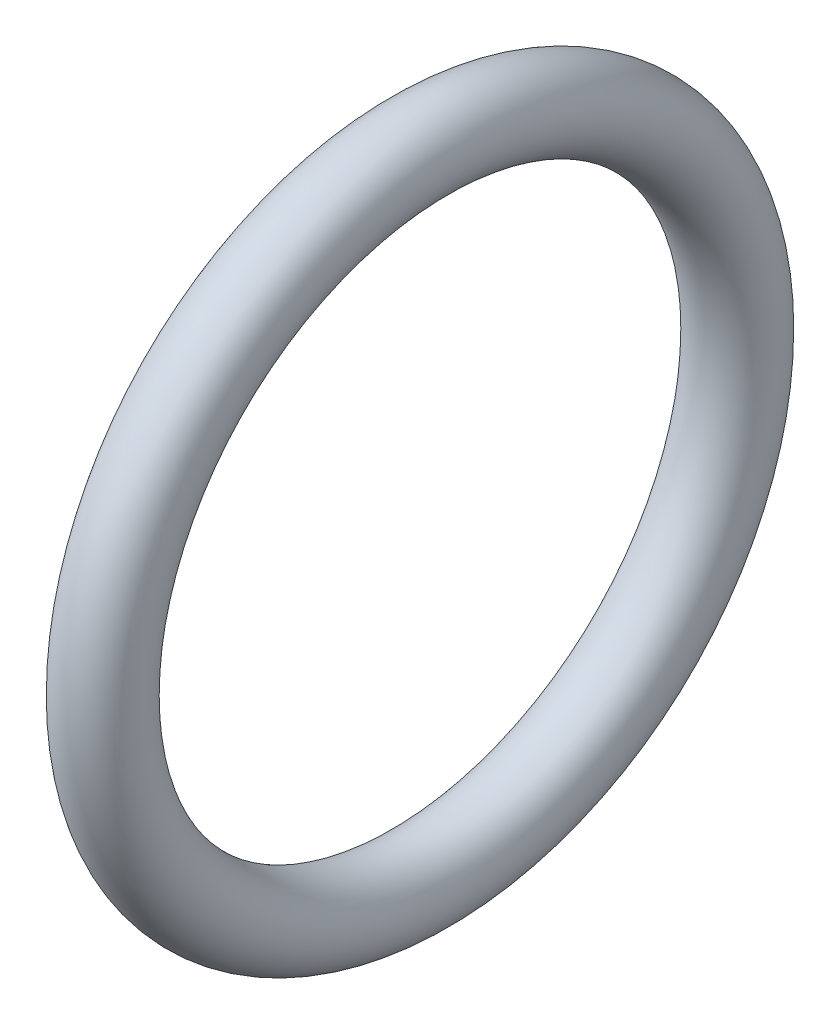
ISO-10303-21;
HEADER;
FILE_DESCRIPTION(('STEP AP214'),'2;1');
FILE_NAME('part.step','',(''),(''),'','','');
FILE_SCHEMA(('AUTOMOTIVE_DESIGN { 1 0 10303 214 1 1 1 1 }'));
ENDSEC;
DATA;
#1=APPLICATION_CONTEXT('core data for automotive mechanical design processes');
#2=APPLICATION_PROTOCOL_DEFINITION('international standard','automotive_design',2000,#1);
#3=PRODUCT_CONTEXT('',#1,'mechanical');
#4=PRODUCT('Part','Part','',(#3));
#5=PRODUCT_RELATED_PRODUCT_CATEGORY('part','',(#4));
#6=PRODUCT_DEFINITION_FORMATION('','',#4);
#7=PRODUCT_DEFINITION_CONTEXT('part definition',#1,'design');
#8=PRODUCT_DEFINITION('design','',#6,#7);
#9=PRODUCT_DEFINITION_SHAPE('','',#8);
#10=(LENGTH_UNIT() NAMED_UNIT(*) SI_UNIT(.MILLI.,.METRE.));
#11=(NAMED_UNIT(*) PLANE_ANGLE_UNIT() SI_UNIT($,.RADIAN.));
#12=(NAMED_UNIT(*) SI_UNIT($,.STERADIAN.) SOLID_ANGLE_UNIT());
#13=UNCERTAINTY_MEASURE_WITH_UNIT(LENGTH_MEASURE(1.E-05),#10,'distance_accuracy_value','');
#14=(GEOMETRIC_REPRESENTATION_CONTEXT(3) GLOBAL_UNCERTAINTY_ASSIGNED_CONTEXT((#13)) GLOBAL_UNIT_ASSIGNED_CONTEXT((#10,
#11,#12)) REPRESENTATION_CONTEXT('',''));
#15=CARTESIAN_POINT('',(0.,0.,0.));
#16=DIRECTION('',(0.,0.,1.));
#17=DIRECTION('',(1.,0.,0.));
#18=AXIS2_PLACEMENT_3D('',#15,#16,#17);
#19=CARTESIAN_POINT('',(0.,0.,0.));
#20=DIRECTION('',(1.,0.,0.));
#21=DIRECTION('',(0.,0.,-1.));
#22=AXIS2_PLACEMENT_3D('',#19,#20,#21);
#23=TOROIDAL_SURFACE('',#22,7.15,0.9);
#24=CARTESIAN_POINT('',(0.,0.,-8.05));
#25=VERTEX_POINT('',#24);
#26=VERTEX_LOOP('',#25);
#27=FACE_BOUND('',#26,.T.);
#28=ADVANCED_FACE('F13',(#27),#23,.T.);
#29=CLOSED_SHELL('',(#28));
#30=MANIFOLD_SOLID_BREP('B1',#29);
#31=ADVANCED_BREP_SHAPE_REPRESENTATION('',(#18,#30),#14);
#32=SHAPE_DEFINITION_REPRESENTATION(#9,#31);
ENDSEC;
END-ISO-10303-21;
